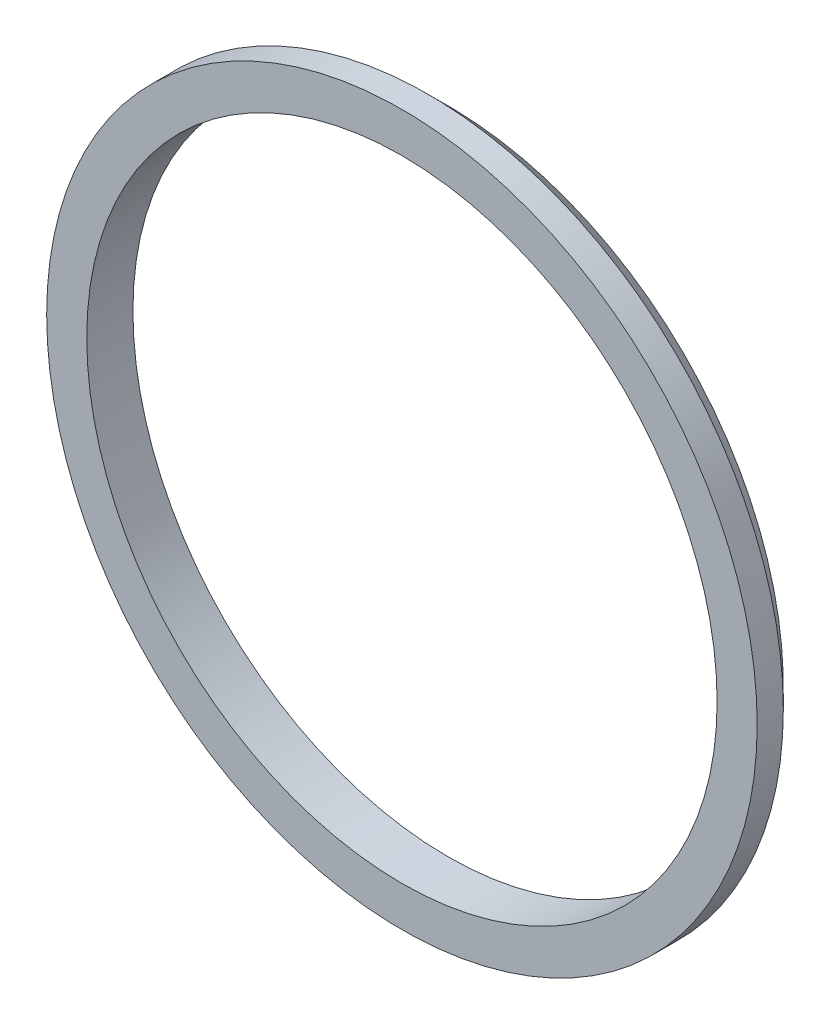
ISO-10303-21;
HEADER;
FILE_DESCRIPTION(('STEP AP214'),'2;1');
FILE_NAME('part.step','',(''),(''),'','','');
FILE_SCHEMA(('AUTOMOTIVE_DESIGN { 1 0 10303 214 1 1 1 1 }'));
ENDSEC;
DATA;
#1=APPLICATION_CONTEXT('core data for automotive mechanical design processes');
#2=APPLICATION_PROTOCOL_DEFINITION('international standard','automotive_design',2000,#1);
#3=PRODUCT_CONTEXT('',#1,'mechanical');
#4=PRODUCT('Part','Part','',(#3));
#5=PRODUCT_RELATED_PRODUCT_CATEGORY('part','',(#4));
#6=PRODUCT_DEFINITION_FORMATION('','',#4);
#7=PRODUCT_DEFINITION_CONTEXT('part definition',#1,'design');
#8=PRODUCT_DEFINITION('design','',#6,#7);
#9=PRODUCT_DEFINITION_SHAPE('','',#8);
#10=(LENGTH_UNIT() NAMED_UNIT(*) SI_UNIT(.MILLI.,.METRE.));
#11=(NAMED_UNIT(*) PLANE_ANGLE_UNIT() SI_UNIT($,.RADIAN.));
#12=(NAMED_UNIT(*) SI_UNIT($,.STERADIAN.) SOLID_ANGLE_UNIT());
#13=UNCERTAINTY_MEASURE_WITH_UNIT(LENGTH_MEASURE(1.E-05),#10,'distance_accuracy_value','');
#14=(GEOMETRIC_REPRESENTATION_CONTEXT(3) GLOBAL_UNCERTAINTY_ASSIGNED_CONTEXT((#13)) GLOBAL_UNIT_ASSIGNED_CONTEXT((#10,
#11,#12)) REPRESENTATION_CONTEXT('',''));
#15=CARTESIAN_POINT('',(0.,0.,0.));
#16=DIRECTION('',(0.,0.,1.));
#17=DIRECTION('',(1.,0.,0.));
#18=AXIS2_PLACEMENT_3D('',#15,#16,#17);
#19=CARTESIAN_POINT('',(0.,0.,6.00000000000007));
#20=DIRECTION('',(0.,0.,1.));
#21=DIRECTION('',(1.,0.,0.));
#22=AXIS2_PLACEMENT_3D('',#19,#20,#21);
#23=CONICAL_SURFACE('',#22,106.366025403784,0.785398163397443);
#24=CARTESIAN_POINT('',(0.,0.,0.));
#25=DIRECTION('',(0.,0.,-1.));
#26=DIRECTION('',(-1.,0.,0.));
#27=AXIS2_PLACEMENT_3D('',#24,#25,#26);
#28=CIRCLE('',#27,100.366025403784);
#29=CARTESIAN_POINT('',(-100.366025403784,0.,0.));
#30=VERTEX_POINT('',#29);
#31=EDGE_CURVE('E10',#30,#30,#28,.T.);
#32=ORIENTED_EDGE('',*,*,#31,.F.);
#33=EDGE_LOOP('',(#32));
#34=FACE_BOUND('',#33,.T.);
#35=CARTESIAN_POINT('',(0.,0.,6.00000000000007));
#36=DIRECTION('',(0.,0.,-1.));
#37=DIRECTION('',(-1.,0.,0.));
#38=AXIS2_PLACEMENT_3D('',#35,#36,#37);
#39=CIRCLE('',#38,106.366025403784);
#40=CARTESIAN_POINT('',(-106.366025403784,0.,6.00000000000007));
#41=VERTEX_POINT('',#40);
#42=EDGE_CURVE('E56',#41,#41,#39,.T.);
#43=ORIENTED_EDGE('',*,*,#42,.T.);
#44=EDGE_LOOP('',(#43));
#45=FACE_BOUND('',#44,.T.);
#46=ADVANCED_FACE('F37',(#34,#45),#23,.T.);
#47=CARTESIAN_POINT('',(100.366025403784,0.,0.));
#48=DIRECTION('',(0.,0.,1.));
#49=DIRECTION('',(1.,0.,0.));
#50=AXIS2_PLACEMENT_3D('',#47,#48,#49);
#51=PLANE('',#50);
#52=CARTESIAN_POINT('',(0.,0.,0.));
#53=DIRECTION('',(0.,0.,-1.));
#54=DIRECTION('',(-1.,0.,0.));
#55=AXIS2_PLACEMENT_3D('',#52,#53,#54);
#56=CIRCLE('',#55,94.3660254037844);
#57=CARTESIAN_POINT('',(-94.3660254037844,0.,0.));
#58=VERTEX_POINT('',#57);
#59=EDGE_CURVE('E43',#58,#58,#56,.T.);
#60=ORIENTED_EDGE('',*,*,#59,.F.);
#61=EDGE_LOOP('',(#60));
#62=FACE_BOUND('',#61,.T.);
#63=ORIENTED_EDGE('',*,*,#31,.T.);
#64=EDGE_LOOP('',(#63));
#65=FACE_BOUND('',#64,.T.);
#66=ADVANCED_FACE('F75',(#62,#65),#51,.F.);
#67=CARTESIAN_POINT('',(0.,0.,0.));
#68=DIRECTION('',(0.,0.,-1.));
#69=DIRECTION('',(-1.,0.,0.));
#70=AXIS2_PLACEMENT_3D('',#67,#68,#69);
#71=CYLINDRICAL_SURFACE('',#70,94.3660254037844);
#72=CARTESIAN_POINT('',(0.,0.,13.825));
#73=DIRECTION('',(0.,0.,-1.));
#74=DIRECTION('',(-1.,0.,0.));
#75=AXIS2_PLACEMENT_3D('',#72,#73,#74);
#76=CIRCLE('',#75,94.3660254037844);
#77=CARTESIAN_POINT('',(-94.3660254037844,0.,13.825));
#78=VERTEX_POINT('',#77);
#79=EDGE_CURVE('E47',#78,#78,#76,.T.);
#80=ORIENTED_EDGE('',*,*,#79,.F.);
#81=EDGE_LOOP('',(#80));
#82=FACE_BOUND('',#81,.T.);
#83=ORIENTED_EDGE('',*,*,#59,.T.);
#84=EDGE_LOOP('',(#83));
#85=FACE_BOUND('',#84,.T.);
#86=ADVANCED_FACE('F70',(#82,#85),#71,.F.);
#87=CARTESIAN_POINT('',(106.366025403784,0.,13.825));
#88=DIRECTION('',(0.,0.,-1.));
#89=DIRECTION('',(-1.,0.,0.));
#90=AXIS2_PLACEMENT_3D('',#87,#88,#89);
#91=PLANE('',#90);
#92=CARTESIAN_POINT('',(0.,0.,13.825));
#93=DIRECTION('',(0.,0.,-1.));
#94=DIRECTION('',(-1.,0.,0.));
#95=AXIS2_PLACEMENT_3D('',#92,#93,#94);
#96=CIRCLE('',#95,106.366025403784);
#97=CARTESIAN_POINT('',(-106.366025403784,0.,13.825));
#98=VERTEX_POINT('',#97);
#99=EDGE_CURVE('E51',#98,#98,#96,.T.);
#100=ORIENTED_EDGE('',*,*,#99,.F.);
#101=EDGE_LOOP('',(#100));
#102=FACE_BOUND('',#101,.T.);
#103=ORIENTED_EDGE('',*,*,#79,.T.);
#104=EDGE_LOOP('',(#103));
#105=FACE_BOUND('',#104,.T.);
#106=ADVANCED_FACE('F64',(#102,#105),#91,.F.);
#107=CARTESIAN_POINT('',(0.,0.,0.));
#108=DIRECTION('',(0.,0.,-1.));
#109=DIRECTION('',(-1.,0.,0.));
#110=AXIS2_PLACEMENT_3D('',#107,#108,#109);
#111=CYLINDRICAL_SURFACE('',#110,106.366025403784);
#112=ORIENTED_EDGE('',*,*,#42,.F.);
#113=EDGE_LOOP('',(#112));
#114=FACE_BOUND('',#113,.T.);
#115=ORIENTED_EDGE('',*,*,#99,.T.);
#116=EDGE_LOOP('',(#115));
#117=FACE_BOUND('',#116,.T.);
#118=ADVANCED_FACE('F61',(#114,#117),#111,.T.);
#119=CLOSED_SHELL('',(#46,#66,#86,#106,#118));
#120=MANIFOLD_SOLID_BREP('B2',#119);
#121=ADVANCED_BREP_SHAPE_REPRESENTATION('',(#18,#120),#14);
#122=SHAPE_DEFINITION_REPRESENTATION(#9,#121);
ENDSEC;
END-ISO-10303-21;
